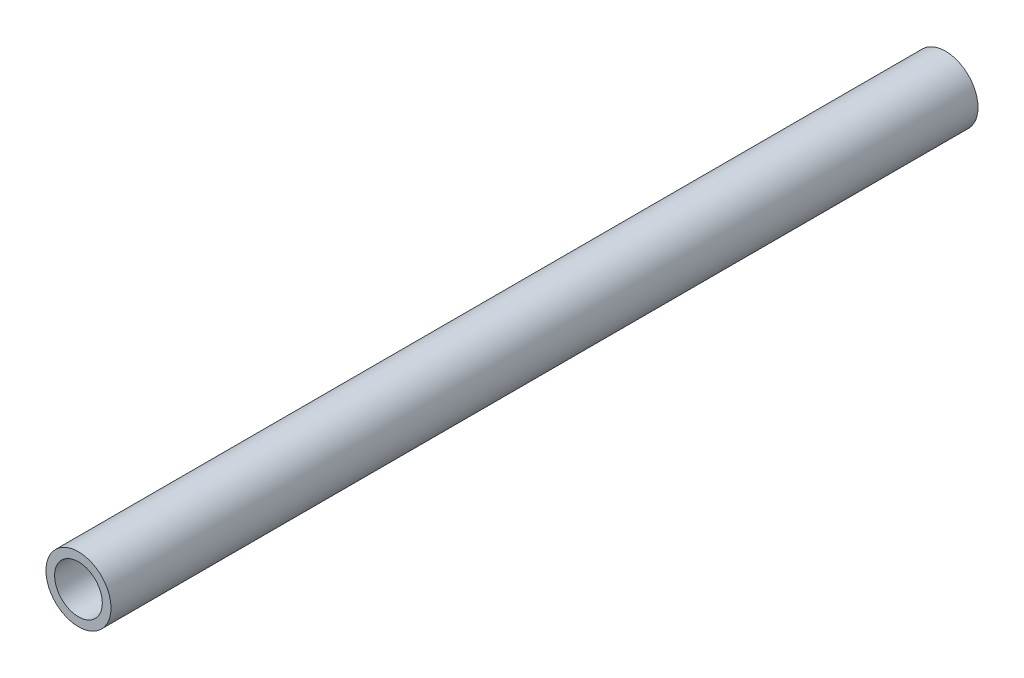
ISO-10303-21;
HEADER;
FILE_DESCRIPTION(('STEP AP214'),'2;1');
FILE_NAME('part.step','',(''),(''),'','','');
FILE_SCHEMA(('AUTOMOTIVE_DESIGN { 1 0 10303 214 1 1 1 1 }'));
ENDSEC;
DATA;
#1=APPLICATION_CONTEXT('core data for automotive mechanical design processes');
#2=APPLICATION_PROTOCOL_DEFINITION('international standard','automotive_design',2000,#1);
#3=PRODUCT_CONTEXT('',#1,'mechanical');
#4=PRODUCT('Part','Part','',(#3));
#5=PRODUCT_RELATED_PRODUCT_CATEGORY('part','',(#4));
#6=PRODUCT_DEFINITION_FORMATION('','',#4);
#7=PRODUCT_DEFINITION_CONTEXT('part definition',#1,'design');
#8=PRODUCT_DEFINITION('design','',#6,#7);
#9=PRODUCT_DEFINITION_SHAPE('','',#8);
#10=(LENGTH_UNIT() NAMED_UNIT(*) SI_UNIT(.MILLI.,.METRE.));
#11=(NAMED_UNIT(*) PLANE_ANGLE_UNIT() SI_UNIT($,.RADIAN.));
#12=(NAMED_UNIT(*) SI_UNIT($,.STERADIAN.) SOLID_ANGLE_UNIT());
#13=UNCERTAINTY_MEASURE_WITH_UNIT(LENGTH_MEASURE(1.E-05),#10,'distance_accuracy_value','');
#14=(GEOMETRIC_REPRESENTATION_CONTEXT(3) GLOBAL_UNCERTAINTY_ASSIGNED_CONTEXT((#13)) GLOBAL_UNIT_ASSIGNED_CONTEXT((#10,
#11,#12)) REPRESENTATION_CONTEXT('',''));
#15=CARTESIAN_POINT('',(0.,0.,0.));
#16=DIRECTION('',(0.,0.,1.));
#17=DIRECTION('',(1.,0.,0.));
#18=AXIS2_PLACEMENT_3D('',#15,#16,#17);
#19=CARTESIAN_POINT('',(-32.8992814964538,249.847725302664,100.));
#20=DIRECTION('',(0.,0.,1.));
#21=DIRECTION('',(1.,0.,0.));
#22=AXIS2_PLACEMENT_3D('',#19,#20,#21);
#23=PLANE('',#22);
#24=CARTESIAN_POINT('',(-32.8992814964538,249.847725302664,100.));
#25=DIRECTION('',(0.,0.,1.));
#26=DIRECTION('',(1.,0.,0.));
#27=AXIS2_PLACEMENT_3D('',#24,#25,#26);
#28=CIRCLE('',#27,3.75);
#29=CARTESIAN_POINT('',(-29.1492814964538,249.847725302664,100.));
#30=VERTEX_POINT('',#29);
#31=EDGE_CURVE('E10',#30,#30,#28,.T.);
#32=ORIENTED_EDGE('',*,*,#31,.T.);
#33=EDGE_LOOP('',(#32));
#34=FACE_BOUND('',#33,.T.);
#35=CARTESIAN_POINT('',(-32.8992814964538,249.847725302664,100.));
#36=DIRECTION('',(0.,0.,1.));
#37=DIRECTION('',(1.,0.,0.));
#38=AXIS2_PLACEMENT_3D('',#35,#36,#37);
#39=CIRCLE('',#38,2.75);
#40=CARTESIAN_POINT('',(-30.1492814964538,249.847725302664,100.));
#41=VERTEX_POINT('',#40);
#42=EDGE_CURVE('E42',#41,#41,#39,.T.);
#43=ORIENTED_EDGE('',*,*,#42,.F.);
#44=EDGE_LOOP('',(#43));
#45=FACE_BOUND('',#44,.T.);
#46=ADVANCED_FACE('F31',(#34,#45),#23,.T.);
#47=CARTESIAN_POINT('',(-32.8992814964538,249.847725302664,0.));
#48=DIRECTION('',(0.,0.,1.));
#49=DIRECTION('',(1.,0.,0.));
#50=AXIS2_PLACEMENT_3D('',#47,#48,#49);
#51=PLANE('',#50);
#52=CARTESIAN_POINT('',(-32.8992814964538,249.847725302664,0.));
#53=DIRECTION('',(0.,0.,1.));
#54=DIRECTION('',(1.,0.,0.));
#55=AXIS2_PLACEMENT_3D('',#52,#53,#54);
#56=CIRCLE('',#55,3.75);
#57=CARTESIAN_POINT('',(-29.1492814964538,249.847725302664,0.));
#58=VERTEX_POINT('',#57);
#59=EDGE_CURVE('E35',#58,#58,#56,.T.);
#60=ORIENTED_EDGE('',*,*,#59,.F.);
#61=EDGE_LOOP('',(#60));
#62=FACE_BOUND('',#61,.T.);
#63=CARTESIAN_POINT('',(-32.8992814964538,249.847725302664,0.));
#64=DIRECTION('',(0.,0.,1.));
#65=DIRECTION('',(1.,0.,0.));
#66=AXIS2_PLACEMENT_3D('',#63,#64,#65);
#67=CIRCLE('',#66,2.75);
#68=CARTESIAN_POINT('',(-30.1492814964538,249.847725302664,0.));
#69=VERTEX_POINT('',#68);
#70=EDGE_CURVE('E44',#69,#69,#67,.T.);
#71=ORIENTED_EDGE('',*,*,#70,.T.);
#72=EDGE_LOOP('',(#71));
#73=FACE_BOUND('',#72,.T.);
#74=ADVANCED_FACE('F54',(#62,#73),#51,.F.);
#75=CARTESIAN_POINT('',(-32.8992814964538,249.847725302664,100.));
#76=DIRECTION('',(0.,0.,-1.));
#77=DIRECTION('',(-1.,0.,0.));
#78=AXIS2_PLACEMENT_3D('',#75,#76,#77);
#79=CYLINDRICAL_SURFACE('',#78,3.75);
#80=ORIENTED_EDGE('',*,*,#31,.F.);
#81=EDGE_LOOP('',(#80));
#82=FACE_BOUND('',#81,.T.);
#83=ORIENTED_EDGE('',*,*,#59,.T.);
#84=EDGE_LOOP('',(#83));
#85=FACE_BOUND('',#84,.T.);
#86=ADVANCED_FACE('F33',(#82,#85),#79,.T.);
#87=CARTESIAN_POINT('',(-32.8992814964538,249.847725302664,100.));
#88=DIRECTION('',(0.,0.,-1.));
#89=DIRECTION('',(-1.,0.,0.));
#90=AXIS2_PLACEMENT_3D('',#87,#88,#89);
#91=CYLINDRICAL_SURFACE('',#90,2.75);
#92=ORIENTED_EDGE('',*,*,#42,.T.);
#93=EDGE_LOOP('',(#92));
#94=FACE_BOUND('',#93,.T.);
#95=ORIENTED_EDGE('',*,*,#70,.F.);
#96=EDGE_LOOP('',(#95));
#97=FACE_BOUND('',#96,.T.);
#98=ADVANCED_FACE('F50',(#94,#97),#91,.F.);
#99=CLOSED_SHELL('',(#46,#74,#86,#98));
#100=MANIFOLD_SOLID_BREP('B2',#99);
#101=ADVANCED_BREP_SHAPE_REPRESENTATION('',(#18,#100),#14);
#102=SHAPE_DEFINITION_REPRESENTATION(#9,#101);
ENDSEC;
END-ISO-10303-21;
